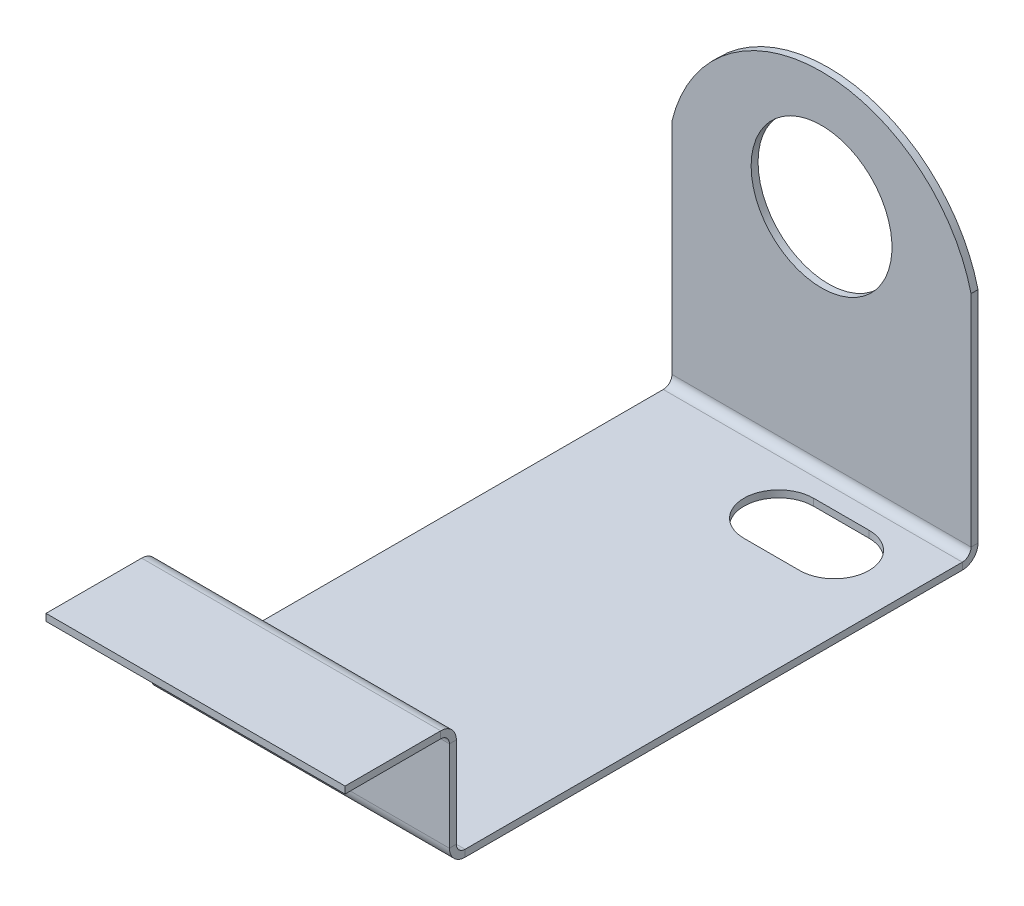
ISO-10303-21;
HEADER;
FILE_DESCRIPTION(('STEP AP214'),'2;1');
FILE_NAME('part.step','',(''),(''),'','','');
FILE_SCHEMA(('AUTOMOTIVE_DESIGN { 1 0 10303 214 1 1 1 1 }'));
ENDSEC;
DATA;
#1=APPLICATION_CONTEXT('core data for automotive mechanical design processes');
#2=APPLICATION_PROTOCOL_DEFINITION('international standard','automotive_design',2000,#1);
#3=PRODUCT_CONTEXT('',#1,'mechanical');
#4=PRODUCT('Part','Part','',(#3));
#5=PRODUCT_RELATED_PRODUCT_CATEGORY('part','',(#4));
#6=PRODUCT_DEFINITION_FORMATION('','',#4);
#7=PRODUCT_DEFINITION_CONTEXT('part definition',#1,'design');
#8=PRODUCT_DEFINITION('design','',#6,#7);
#9=PRODUCT_DEFINITION_SHAPE('','',#8);
#10=(LENGTH_UNIT() NAMED_UNIT(*) SI_UNIT(.MILLI.,.METRE.));
#11=(NAMED_UNIT(*) PLANE_ANGLE_UNIT() SI_UNIT($,.RADIAN.));
#12=(NAMED_UNIT(*) SI_UNIT($,.STERADIAN.) SOLID_ANGLE_UNIT());
#13=UNCERTAINTY_MEASURE_WITH_UNIT(LENGTH_MEASURE(1.E-05),#10,'distance_accuracy_value','');
#14=(GEOMETRIC_REPRESENTATION_CONTEXT(3) GLOBAL_UNCERTAINTY_ASSIGNED_CONTEXT((#13)) GLOBAL_UNIT_ASSIGNED_CONTEXT((#10,
#11,#12)) REPRESENTATION_CONTEXT('',''));
#15=CARTESIAN_POINT('',(0.,0.,0.));
#16=DIRECTION('',(0.,0.,1.));
#17=DIRECTION('',(1.,0.,0.));
#18=AXIS2_PLACEMENT_3D('',#15,#16,#17);
#19=CARTESIAN_POINT('',(86.,-148.497787143782,-31.9999999999995));
#20=DIRECTION('',(-1.,0.,0.));
#21=DIRECTION('',(0.,1.,0.));
#22=AXIS2_PLACEMENT_3D('',#19,#20,#21);
#23=PLANE('',#22);
#24=DIRECTION('',(0.,1.,0.));
#25=VECTOR('',#24,1.);
#26=CARTESIAN_POINT('',(86.,-148.497787143782,-31.9999999999995));
#27=LINE('',#26,#25);
#28=CARTESIAN_POINT('',(86.,2.49999999999999,-32.));
#29=VERTEX_POINT('',#28);
#30=CARTESIAN_POINT('',(86.,28.5000000000001,-32.0000000000001));
#31=VERTEX_POINT('',#30);
#32=EDGE_CURVE('E372',#29,#31,#27,.T.);
#33=ORIENTED_EDGE('',*,*,#32,.T.);
#34=DIRECTION('',(0.,0.,1.));
#35=VECTOR('',#34,1.);
#36=CARTESIAN_POINT('',(86.,28.5000000000001,-32.0000000000002));
#37=LINE('',#36,#35);
#38=CARTESIAN_POINT('',(86.,28.5,-30.0000000000001));
#39=VERTEX_POINT('',#38);
#40=EDGE_CURVE('E12',#31,#39,#37,.T.);
#41=ORIENTED_EDGE('',*,*,#40,.T.);
#42=DIRECTION('',(0.,1.,0.));
#43=VECTOR('',#42,1.);
#44=CARTESIAN_POINT('',(86.,-148.497787143782,-29.9999999999995));
#45=LINE('',#44,#43);
#46=CARTESIAN_POINT('',(86.,2.50000000000002,-30.));
#47=VERTEX_POINT('',#46);
#48=EDGE_CURVE('E271',#47,#39,#45,.T.);
#49=ORIENTED_EDGE('',*,*,#48,.F.);
#50=DIRECTION('',(0.,0.,1.));
#51=VECTOR('',#50,1.);
#52=CARTESIAN_POINT('',(86.,2.50000000000006,-32.0000000000001));
#53=LINE('',#52,#51);
#54=EDGE_CURVE('E355',#29,#47,#53,.T.);
#55=ORIENTED_EDGE('',*,*,#54,.F.);
#56=EDGE_LOOP('',(#33,#41,#49,#55));
#57=FACE_BOUND('',#56,.T.);
#58=ADVANCED_FACE('F37',(#57),#23,.F.);
#59=CARTESIAN_POINT('',(0.,-148.497787143782,-31.9999999999995));
#60=DIRECTION('',(0.,0.,1.));
#61=DIRECTION('',(0.,-1.,0.));
#62=AXIS2_PLACEMENT_3D('',#59,#60,#61);
#63=PLANE('',#62);
#64=DIRECTION('',(0.,1.,0.));
#65=VECTOR('',#64,1.);
#66=CARTESIAN_POINT('',(0.,-148.497787143782,-31.9999999999995));
#67=LINE('',#66,#65);
#68=CARTESIAN_POINT('',(0.,2.50000000000001,-32.));
#69=VERTEX_POINT('',#68);
#70=CARTESIAN_POINT('',(0.,28.5000000000001,-32.0000000000001));
#71=VERTEX_POINT('',#70);
#72=EDGE_CURVE('E40',#69,#71,#67,.T.);
#73=ORIENTED_EDGE('',*,*,#72,.T.);
#74=DIRECTION('',(1.,0.,0.));
#75=VECTOR('',#74,1.);
#76=CARTESIAN_POINT('',(0.,28.5000000000001,-32.0000000000001));
#77=LINE('',#76,#75);
#78=EDGE_CURVE('E365',#71,#31,#77,.T.);
#79=ORIENTED_EDGE('',*,*,#78,.T.);
#80=ORIENTED_EDGE('',*,*,#32,.F.);
#81=DIRECTION('',(1.,0.,0.));
#82=VECTOR('',#81,1.);
#83=CARTESIAN_POINT('',(0.,2.50000000000006,-32.));
#84=LINE('',#83,#82);
#85=EDGE_CURVE('E352',#69,#29,#84,.T.);
#86=ORIENTED_EDGE('',*,*,#85,.F.);
#87=EDGE_LOOP('',(#73,#79,#80,#86));
#88=FACE_BOUND('',#87,.T.);
#89=ADVANCED_FACE('F383',(#88),#63,.F.);
#90=CARTESIAN_POINT('',(0.,-148.497787143782,-29.9999999999995));
#91=DIRECTION('',(1.,0.,0.));
#92=DIRECTION('',(0.,-1.,0.));
#93=AXIS2_PLACEMENT_3D('',#90,#91,#92);
#94=PLANE('',#93);
#95=DIRECTION('',(0.,1.,0.));
#96=VECTOR('',#95,1.);
#97=CARTESIAN_POINT('',(0.,-148.497787143782,-29.9999999999995));
#98=LINE('',#97,#96);
#99=CARTESIAN_POINT('',(0.,2.50000000000002,-30.));
#100=VERTEX_POINT('',#99);
#101=CARTESIAN_POINT('',(0.,28.5000000000001,-30.0000000000001));
#102=VERTEX_POINT('',#101);
#103=EDGE_CURVE('E356',#100,#102,#98,.T.);
#104=ORIENTED_EDGE('',*,*,#103,.T.);
#105=DIRECTION('',(0.,0.,-1.));
#106=VECTOR('',#105,1.);
#107=CARTESIAN_POINT('',(0.,28.5000000000001,-30.0000000000002));
#108=LINE('',#107,#106);
#109=EDGE_CURVE('E368',#102,#71,#108,.T.);
#110=ORIENTED_EDGE('',*,*,#109,.T.);
#111=ORIENTED_EDGE('',*,*,#72,.F.);
#112=DIRECTION('',(0.,0.,-1.));
#113=VECTOR('',#112,1.);
#114=CARTESIAN_POINT('',(0.,2.50000000000007,-30.0000000000001));
#115=LINE('',#114,#113);
#116=EDGE_CURVE('E362',#100,#69,#115,.T.);
#117=ORIENTED_EDGE('',*,*,#116,.F.);
#118=EDGE_LOOP('',(#104,#110,#111,#117));
#119=FACE_BOUND('',#118,.T.);
#120=ADVANCED_FACE('F386',(#119),#94,.F.);
#121=CARTESIAN_POINT('',(0.,-148.497787143782,-29.9999999999995));
#122=DIRECTION('',(0.,0.,1.));
#123=DIRECTION('',(0.,-1.,0.));
#124=AXIS2_PLACEMENT_3D('',#121,#122,#123);
#125=PLANE('',#124);
#126=DIRECTION('',(1.,0.,0.));
#127=VECTOR('',#126,1.);
#128=CARTESIAN_POINT('',(0.,28.5000000000001,-30.0000000000001));
#129=LINE('',#128,#127);
#130=EDGE_CURVE('E45',#102,#39,#129,.T.);
#131=ORIENTED_EDGE('',*,*,#130,.F.);
#132=ORIENTED_EDGE('',*,*,#103,.F.);
#133=DIRECTION('',(1.,0.,0.));
#134=VECTOR('',#133,1.);
#135=CARTESIAN_POINT('',(0.,2.50000000000007,-30.));
#136=LINE('',#135,#134);
#137=EDGE_CURVE('E359',#100,#47,#136,.T.);
#138=ORIENTED_EDGE('',*,*,#137,.T.);
#139=ORIENTED_EDGE('',*,*,#48,.T.);
#140=EDGE_LOOP('',(#131,#132,#138,#139));
#141=FACE_BOUND('',#140,.T.);
#142=ADVANCED_FACE('F454',(#141),#125,.T.);
#143=CARTESIAN_POINT('',(43.,55.1788366009013,-180.));
#144=DIRECTION('',(0.,0.,-1.));
#145=DIRECTION('',(-1.,0.,0.));
#146=AXIS2_PLACEMENT_3D('',#143,#144,#145);
#147=CYLINDRICAL_SURFACE('',#146,44.2489583618449);
#148=DIRECTION('',(0.,0.,1.));
#149=VECTOR('',#148,1.);
#150=CARTESIAN_POINT('',(0.,65.6177214124262,-180.));
#151=LINE('',#150,#149);
#152=CARTESIAN_POINT('',(0.,65.6177214124262,-180.));
#153=VERTEX_POINT('',#152);
#154=CARTESIAN_POINT('',(0.,65.6177214124262,-182.));
#155=VERTEX_POINT('',#154);
#156=EDGE_CURVE('E341',#153,#155,#151,.F.);
#157=ORIENTED_EDGE('',*,*,#156,.F.);
#158=CARTESIAN_POINT('',(43.,55.1788366009013,-180.));
#159=DIRECTION('',(0.,0.,-1.));
#160=DIRECTION('',(-1.,0.,0.));
#161=AXIS2_PLACEMENT_3D('',#158,#159,#160);
#162=CIRCLE('',#161,44.2489583618449);
#163=CARTESIAN_POINT('',(86.,65.6177214124262,-180.));
#164=VERTEX_POINT('',#163);
#165=EDGE_CURVE('E324',#164,#153,#162,.F.);
#166=ORIENTED_EDGE('',*,*,#165,.F.);
#167=DIRECTION('',(0.,0.,1.));
#168=VECTOR('',#167,1.);
#169=CARTESIAN_POINT('',(86.,65.6177214124262,-180.));
#170=LINE('',#169,#168);
#171=CARTESIAN_POINT('',(86.,65.6177214124262,-182.));
#172=VERTEX_POINT('',#171);
#173=EDGE_CURVE('E349',#164,#172,#170,.F.);
#174=ORIENTED_EDGE('',*,*,#173,.T.);
#175=CARTESIAN_POINT('',(43.,55.1788366009013,-182.));
#176=DIRECTION('',(0.,0.,-1.));
#177=DIRECTION('',(-1.,0.,0.));
#178=AXIS2_PLACEMENT_3D('',#175,#176,#177);
#179=CIRCLE('',#178,44.2489583618449);
#180=EDGE_CURVE('E347',#172,#155,#179,.F.);
#181=ORIENTED_EDGE('',*,*,#180,.T.);
#182=EDGE_LOOP('',(#157,#166,#174,#181));
#183=FACE_BOUND('',#182,.T.);
#184=ADVANCED_FACE('F456',(#183),#147,.T.);
#185=CARTESIAN_POINT('',(43.0084201572259,65.7834199573394,-172.));
#186=DIRECTION('',(0.,0.,-1.));
#187=DIRECTION('',(-1.,0.,0.));
#188=AXIS2_PLACEMENT_3D('',#185,#186,#187);
#189=CYLINDRICAL_SURFACE('',#188,20.25);
#190=CARTESIAN_POINT('',(43.0084201572259,65.7834199573394,-182.));
#191=DIRECTION('',(0.,0.,-1.));
#192=DIRECTION('',(-1.,0.,0.));
#193=AXIS2_PLACEMENT_3D('',#190,#191,#192);
#194=CIRCLE('',#193,20.25);
#195=CARTESIAN_POINT('',(22.7584201572259,65.7834199573394,-182.));
#196=VERTEX_POINT('',#195);
#197=EDGE_CURVE('E344',#196,#196,#194,.T.);
#198=ORIENTED_EDGE('',*,*,#197,.T.);
#199=EDGE_LOOP('',(#198));
#200=FACE_BOUND('',#199,.T.);
#201=CARTESIAN_POINT('',(43.0084201572259,65.7834199573394,-180.));
#202=DIRECTION('',(0.,0.,-1.));
#203=DIRECTION('',(-1.,0.,0.));
#204=AXIS2_PLACEMENT_3D('',#201,#202,#203);
#205=CIRCLE('',#204,20.25);
#206=CARTESIAN_POINT('',(22.7584201572259,65.7834199573394,-180.));
#207=VERTEX_POINT('',#206);
#208=EDGE_CURVE('E327',#207,#207,#205,.T.);
#209=ORIENTED_EDGE('',*,*,#208,.F.);
#210=EDGE_LOOP('',(#209));
#211=FACE_BOUND('',#210,.T.);
#212=ADVANCED_FACE('F461',(#200,#211),#189,.F.);
#213=CARTESIAN_POINT('',(0.,0.,-182.));
#214=DIRECTION('',(-1.,0.,0.));
#215=DIRECTION('',(0.,0.,1.));
#216=AXIS2_PLACEMENT_3D('',#213,#214,#215);
#217=PLANE('',#216);
#218=DIRECTION('',(0.,-1.,0.));
#219=VECTOR('',#218,1.);
#220=CARTESIAN_POINT('',(0.,0.,-180.));
#221=LINE('',#220,#219);
#222=CARTESIAN_POINT('',(0.,2.49999999999998,-180.));
#223=VERTEX_POINT('',#222);
#224=EDGE_CURVE('E322',#153,#223,#221,.T.);
#225=ORIENTED_EDGE('',*,*,#224,.F.);
#226=ORIENTED_EDGE('',*,*,#156,.T.);
#227=DIRECTION('',(0.,-1.,0.));
#228=VECTOR('',#227,1.);
#229=CARTESIAN_POINT('',(0.,0.,-182.));
#230=LINE('',#229,#228);
#231=CARTESIAN_POINT('',(0.,2.50000000000002,-182.));
#232=VERTEX_POINT('',#231);
#233=EDGE_CURVE('E339',#155,#232,#230,.T.);
#234=ORIENTED_EDGE('',*,*,#233,.T.);
#235=DIRECTION('',(0.,0.,-1.));
#236=VECTOR('',#235,1.);
#237=CARTESIAN_POINT('',(0.,2.5,-180.));
#238=LINE('',#237,#236);
#239=EDGE_CURVE('E316',#223,#232,#238,.T.);
#240=ORIENTED_EDGE('',*,*,#239,.F.);
#241=EDGE_LOOP('',(#225,#226,#234,#240));
#242=FACE_BOUND('',#241,.T.);
#243=ADVANCED_FACE('F502',(#242),#217,.T.);
#244=CARTESIAN_POINT('',(0.,0.,-182.));
#245=DIRECTION('',(0.,0.,-1.));
#246=DIRECTION('',(-1.,0.,0.));
#247=AXIS2_PLACEMENT_3D('',#244,#245,#246);
#248=PLANE('',#247);
#249=ORIENTED_EDGE('',*,*,#197,.F.);
#250=EDGE_LOOP('',(#249));
#251=FACE_BOUND('',#250,.T.);
#252=ORIENTED_EDGE('',*,*,#233,.F.);
#253=ORIENTED_EDGE('',*,*,#180,.F.);
#254=DIRECTION('',(0.,1.,0.));
#255=VECTOR('',#254,1.);
#256=CARTESIAN_POINT('',(86.,100.,-182.));
#257=LINE('',#256,#255);
#258=CARTESIAN_POINT('',(86.,2.49999999999998,-182.));
#259=VERTEX_POINT('',#258);
#260=EDGE_CURVE('E333',#259,#172,#257,.T.);
#261=ORIENTED_EDGE('',*,*,#260,.F.);
#262=DIRECTION('',(-1.,0.,0.));
#263=VECTOR('',#262,1.);
#264=CARTESIAN_POINT('',(0.,2.50000000000002,-182.));
#265=LINE('',#264,#263);
#266=EDGE_CURVE('E336',#259,#232,#265,.T.);
#267=ORIENTED_EDGE('',*,*,#266,.T.);
#268=EDGE_LOOP('',(#252,#253,#261,#267));
#269=FACE_BOUND('',#268,.T.);
#270=ADVANCED_FACE('F498',(#251,#269),#248,.T.);
#271=CARTESIAN_POINT('',(86.,100.,-182.));
#272=DIRECTION('',(1.,0.,0.));
#273=DIRECTION('',(0.,0.,-1.));
#274=AXIS2_PLACEMENT_3D('',#271,#272,#273);
#275=PLANE('',#274);
#276=ORIENTED_EDGE('',*,*,#260,.T.);
#277=ORIENTED_EDGE('',*,*,#173,.F.);
#278=DIRECTION('',(0.,1.,0.));
#279=VECTOR('',#278,1.);
#280=CARTESIAN_POINT('',(86.,100.,-180.));
#281=LINE('',#280,#279);
#282=CARTESIAN_POINT('',(86.,2.49999999999998,-180.));
#283=VERTEX_POINT('',#282);
#284=EDGE_CURVE('E319',#283,#164,#281,.T.);
#285=ORIENTED_EDGE('',*,*,#284,.F.);
#286=DIRECTION('',(0.,0.,-1.));
#287=VECTOR('',#286,1.);
#288=CARTESIAN_POINT('',(86.,2.5,-180.));
#289=LINE('',#288,#287);
#290=EDGE_CURVE('E330',#283,#259,#289,.T.);
#291=ORIENTED_EDGE('',*,*,#290,.T.);
#292=EDGE_LOOP('',(#276,#277,#285,#291));
#293=FACE_BOUND('',#292,.T.);
#294=ADVANCED_FACE('F494',(#293),#275,.T.);
#295=CARTESIAN_POINT('',(0.,0.,-180.));
#296=DIRECTION('',(0.,0.,-1.));
#297=DIRECTION('',(-1.,0.,0.));
#298=AXIS2_PLACEMENT_3D('',#295,#296,#297);
#299=PLANE('',#298);
#300=ORIENTED_EDGE('',*,*,#208,.T.);
#301=EDGE_LOOP('',(#300));
#302=FACE_BOUND('',#301,.T.);
#303=ORIENTED_EDGE('',*,*,#165,.T.);
#304=ORIENTED_EDGE('',*,*,#224,.T.);
#305=DIRECTION('',(-1.,0.,0.));
#306=VECTOR('',#305,1.);
#307=CARTESIAN_POINT('',(86.,2.5,-180.));
#308=LINE('',#307,#306);
#309=EDGE_CURVE('E299',#283,#223,#308,.T.);
#310=ORIENTED_EDGE('',*,*,#309,.F.);
#311=ORIENTED_EDGE('',*,*,#284,.T.);
#312=EDGE_LOOP('',(#303,#304,#310,#311));
#313=FACE_BOUND('',#312,.T.);
#314=ADVANCED_FACE('F490',(#302,#313),#299,.F.);
#315=CARTESIAN_POINT('',(0.,2.49999999999998,-177.5));
#316=DIRECTION('',(1.,0.,0.));
#317=DIRECTION('',(0.,0.,-1.));
#318=AXIS2_PLACEMENT_3D('',#315,#316,#317);
#319=PLANE('',#318);
#320=CARTESIAN_POINT('',(0.,2.49999999999998,-177.5));
#321=DIRECTION('',(-1.,0.,0.));
#322=DIRECTION('',(0.,0.,1.));
#323=AXIS2_PLACEMENT_3D('',#320,#321,#322);
#324=CIRCLE('',#323,2.5);
#325=CARTESIAN_POINT('',(0.,0.,-177.5));
#326=VERTEX_POINT('',#325);
#327=EDGE_CURVE('E296',#223,#326,#324,.T.);
#328=ORIENTED_EDGE('',*,*,#327,.F.);
#329=ORIENTED_EDGE('',*,*,#239,.T.);
#330=CARTESIAN_POINT('',(0.,2.49999999999998,-177.5));
#331=DIRECTION('',(-1.,0.,0.));
#332=DIRECTION('',(0.,0.,1.));
#333=AXIS2_PLACEMENT_3D('',#330,#331,#332);
#334=CIRCLE('',#333,4.5);
#335=CARTESIAN_POINT('',(0.,-2.00000000000002,-177.5));
#336=VERTEX_POINT('',#335);
#337=EDGE_CURVE('E313',#232,#336,#334,.T.);
#338=ORIENTED_EDGE('',*,*,#337,.T.);
#339=DIRECTION('',(0.,-1.,0.));
#340=VECTOR('',#339,1.);
#341=CARTESIAN_POINT('',(0.,0.,-177.5));
#342=LINE('',#341,#340);
#343=EDGE_CURVE('E268',#326,#336,#342,.T.);
#344=ORIENTED_EDGE('',*,*,#343,.F.);
#345=EDGE_LOOP('',(#328,#329,#338,#344));
#346=FACE_BOUND('',#345,.T.);
#347=ADVANCED_FACE('F486',(#346),#319,.F.);
#348=CARTESIAN_POINT('',(0.,2.49999999999998,-177.5));
#349=DIRECTION('',(-1.,0.,0.));
#350=DIRECTION('',(0.,0.,-1.));
#351=AXIS2_PLACEMENT_3D('',#348,#349,#350);
#352=CYLINDRICAL_SURFACE('',#351,4.5);
#353=DIRECTION('',(-1.,0.,0.));
#354=VECTOR('',#353,1.);
#355=CARTESIAN_POINT('',(0.,-2.00000000000002,-177.5));
#356=LINE('',#355,#354);
#357=CARTESIAN_POINT('',(86.,-2.,-177.5));
#358=VERTEX_POINT('',#357);
#359=EDGE_CURVE('E281',#336,#358,#356,.F.);
#360=ORIENTED_EDGE('',*,*,#359,.F.);
#361=ORIENTED_EDGE('',*,*,#337,.F.);
#362=ORIENTED_EDGE('',*,*,#266,.F.);
#363=CARTESIAN_POINT('',(86.,2.49999999999998,-177.5));
#364=DIRECTION('',(-1.,0.,0.));
#365=DIRECTION('',(0.,0.,1.));
#366=AXIS2_PLACEMENT_3D('',#363,#364,#365);
#367=CIRCLE('',#366,4.5);
#368=EDGE_CURVE('E307',#358,#259,#367,.F.);
#369=ORIENTED_EDGE('',*,*,#368,.F.);
#370=EDGE_LOOP('',(#360,#361,#362,#369));
#371=FACE_BOUND('',#370,.T.);
#372=ADVANCED_FACE('F482',(#371),#352,.T.);
#373=CARTESIAN_POINT('',(86.,2.49999999999998,-177.5));
#374=DIRECTION('',(1.,0.,0.));
#375=DIRECTION('',(0.,0.,-1.));
#376=AXIS2_PLACEMENT_3D('',#373,#374,#375);
#377=PLANE('',#376);
#378=ORIENTED_EDGE('',*,*,#290,.F.);
#379=CARTESIAN_POINT('',(86.,2.49999999999998,-177.5));
#380=DIRECTION('',(-1.,0.,0.));
#381=DIRECTION('',(0.,0.,1.));
#382=AXIS2_PLACEMENT_3D('',#379,#380,#381);
#383=CIRCLE('',#382,2.5);
#384=CARTESIAN_POINT('',(86.,0.,-177.5));
#385=VERTEX_POINT('',#384);
#386=EDGE_CURVE('E302',#385,#283,#383,.F.);
#387=ORIENTED_EDGE('',*,*,#386,.F.);
#388=DIRECTION('',(0.,-1.,0.));
#389=VECTOR('',#388,1.);
#390=CARTESIAN_POINT('',(86.,0.,-177.5));
#391=LINE('',#390,#389);
#392=EDGE_CURVE('E310',#385,#358,#391,.T.);
#393=ORIENTED_EDGE('',*,*,#392,.T.);
#394=ORIENTED_EDGE('',*,*,#368,.T.);
#395=EDGE_LOOP('',(#378,#387,#393,#394));
#396=FACE_BOUND('',#395,.T.);
#397=ADVANCED_FACE('F478',(#396),#377,.T.);
#398=CARTESIAN_POINT('',(0.,2.49999999999998,-177.5));
#399=DIRECTION('',(-1.,0.,0.));
#400=DIRECTION('',(0.,0.,-1.));
#401=AXIS2_PLACEMENT_3D('',#398,#399,#400);
#402=CYLINDRICAL_SURFACE('',#401,2.5);
#403=DIRECTION('',(-1.,0.,0.));
#404=VECTOR('',#403,1.);
#405=CARTESIAN_POINT('',(0.,0.,-177.5));
#406=LINE('',#405,#404);
#407=EDGE_CURVE('E305',#326,#385,#406,.F.);
#408=ORIENTED_EDGE('',*,*,#407,.T.);
#409=ORIENTED_EDGE('',*,*,#386,.T.);
#410=ORIENTED_EDGE('',*,*,#309,.T.);
#411=ORIENTED_EDGE('',*,*,#327,.T.);
#412=EDGE_LOOP('',(#408,#409,#410,#411));
#413=FACE_BOUND('',#412,.T.);
#414=ADVANCED_FACE('F474',(#413),#402,.F.);
#415=CARTESIAN_POINT('',(0.,0.,-180.));
#416=DIRECTION('',(0.,-1.,0.));
#417=DIRECTION('',(0.,0.,-1.));
#418=AXIS2_PLACEMENT_3D('',#415,#416,#417);
#419=PLANE('',#418);
#420=DIRECTION('',(-1.,0.,0.));
#421=VECTOR('',#420,1.);
#422=CARTESIAN_POINT('',(64.665337354633,0.,-172.034002172437));
#423=LINE('',#422,#421);
#424=CARTESIAN_POINT('',(64.665337354633,0.,-172.034002172437));
#425=VERTEX_POINT('',#424);
#426=CARTESIAN_POINT('',(48.665337354633,0.,-172.034002172437));
#427=VERTEX_POINT('',#426);
#428=EDGE_CURVE('E202',#425,#427,#423,.T.);
#429=ORIENTED_EDGE('',*,*,#428,.F.);
#430=CARTESIAN_POINT('',(64.665337354633,0.,-162.034002172437));
#431=DIRECTION('',(0.,1.,0.));
#432=DIRECTION('',(0.,0.,1.));
#433=AXIS2_PLACEMENT_3D('',#430,#431,#432);
#434=CIRCLE('',#433,9.99999999999998);
#435=CARTESIAN_POINT('',(64.665337354633,0.,-152.034002172437));
#436=VERTEX_POINT('',#435);
#437=EDGE_CURVE('E53',#436,#425,#434,.T.);
#438=ORIENTED_EDGE('',*,*,#437,.F.);
#439=DIRECTION('',(1.,0.,0.));
#440=VECTOR('',#439,1.);
#441=CARTESIAN_POINT('',(64.665337354633,0.,-152.034002172437));
#442=LINE('',#441,#440);
#443=CARTESIAN_POINT('',(48.665337354633,0.,-152.034002172437));
#444=VERTEX_POINT('',#443);
#445=EDGE_CURVE('E193',#444,#436,#442,.T.);
#446=ORIENTED_EDGE('',*,*,#445,.F.);
#447=CARTESIAN_POINT('',(48.665337354633,0.,-162.034002172437));
#448=DIRECTION('',(0.,1.,0.));
#449=DIRECTION('',(0.,0.,-1.));
#450=AXIS2_PLACEMENT_3D('',#447,#448,#449);
#451=CIRCLE('',#450,9.99999999999998);
#452=EDGE_CURVE('E196',#427,#444,#451,.T.);
#453=ORIENTED_EDGE('',*,*,#452,.F.);
#454=EDGE_LOOP('',(#429,#438,#446,#453));
#455=FACE_BOUND('',#454,.T.);
#456=DIRECTION('',(0.,0.,1.));
#457=VECTOR('',#456,1.);
#458=CARTESIAN_POINT('',(0.,0.,-180.));
#459=LINE('',#458,#457);
#460=CARTESIAN_POINT('',(0.,0.,-34.5));
#461=VERTEX_POINT('',#460);
#462=EDGE_CURVE('E293',#326,#461,#459,.T.);
#463=ORIENTED_EDGE('',*,*,#462,.T.);
#464=DIRECTION('',(1.,0.,0.));
#465=VECTOR('',#464,1.);
#466=CARTESIAN_POINT('',(0.,0.,-34.5));
#467=LINE('',#466,#465);
#468=CARTESIAN_POINT('',(86.,0.,-34.5));
#469=VERTEX_POINT('',#468);
#470=EDGE_CURVE('E290',#461,#469,#467,.T.);
#471=ORIENTED_EDGE('',*,*,#470,.T.);
#472=DIRECTION('',(0.,0.,1.));
#473=VECTOR('',#472,1.);
#474=CARTESIAN_POINT('',(86.,0.,-180.));
#475=LINE('',#474,#473);
#476=EDGE_CURVE('E287',#385,#469,#475,.T.);
#477=ORIENTED_EDGE('',*,*,#476,.F.);
#478=ORIENTED_EDGE('',*,*,#407,.F.);
#479=EDGE_LOOP('',(#463,#471,#477,#478));
#480=FACE_BOUND('',#479,.T.);
#481=ADVANCED_FACE('F441',(#455,#480),#419,.F.);
#482=CARTESIAN_POINT('',(86.,0.,-180.));
#483=DIRECTION('',(-1.,0.,0.));
#484=DIRECTION('',(0.,0.,1.));
#485=AXIS2_PLACEMENT_3D('',#482,#483,#484);
#486=PLANE('',#485);
#487=ORIENTED_EDGE('',*,*,#476,.T.);
#488=DIRECTION('',(0.,-1.,0.));
#489=VECTOR('',#488,1.);
#490=CARTESIAN_POINT('',(86.,0.,-34.5));
#491=LINE('',#490,#489);
#492=CARTESIAN_POINT('',(86.,-2.,-34.5));
#493=VERTEX_POINT('',#492);
#494=EDGE_CURVE('E284',#469,#493,#491,.T.);
#495=ORIENTED_EDGE('',*,*,#494,.T.);
#496=DIRECTION('',(0.,0.,1.));
#497=VECTOR('',#496,1.);
#498=CARTESIAN_POINT('',(86.,-2.,-180.));
#499=LINE('',#498,#497);
#500=EDGE_CURVE('E278',#358,#493,#499,.T.);
#501=ORIENTED_EDGE('',*,*,#500,.F.);
#502=ORIENTED_EDGE('',*,*,#392,.F.);
#503=EDGE_LOOP('',(#487,#495,#501,#502));
#504=FACE_BOUND('',#503,.T.);
#505=ADVANCED_FACE('F436',(#504),#486,.F.);
#506=CARTESIAN_POINT('',(0.,-2.,-180.));
#507=DIRECTION('',(0.,-1.,0.));
#508=DIRECTION('',(0.,0.,-1.));
#509=AXIS2_PLACEMENT_3D('',#506,#507,#508);
#510=PLANE('',#509);
#511=CARTESIAN_POINT('',(64.665337354633,-2.00000000000002,-162.034002172437));
#512=DIRECTION('',(0.,1.,0.));
#513=DIRECTION('',(0.,0.,1.));
#514=AXIS2_PLACEMENT_3D('',#511,#512,#513);
#515=CIRCLE('',#514,9.99999999999998);
#516=CARTESIAN_POINT('',(64.665337354633,-2.00000000000002,-152.034002172437));
#517=VERTEX_POINT('',#516);
#518=CARTESIAN_POINT('',(64.665337354633,-2.00000000000002,-172.034002172437));
#519=VERTEX_POINT('',#518);
#520=EDGE_CURVE('E177',#517,#519,#515,.T.);
#521=ORIENTED_EDGE('',*,*,#520,.T.);
#522=DIRECTION('',(-1.,0.,0.));
#523=VECTOR('',#522,1.);
#524=CARTESIAN_POINT('',(64.665337354633,-2.00000000000002,-172.034002172437));
#525=LINE('',#524,#523);
#526=CARTESIAN_POINT('',(48.665337354633,-2.,-172.034002172437));
#527=VERTEX_POINT('',#526);
#528=EDGE_CURVE('E186',#519,#527,#525,.T.);
#529=ORIENTED_EDGE('',*,*,#528,.T.);
#530=CARTESIAN_POINT('',(48.665337354633,-2.00000000000002,-162.034002172437));
#531=DIRECTION('',(0.,1.,0.));
#532=DIRECTION('',(0.,0.,-1.));
#533=AXIS2_PLACEMENT_3D('',#530,#531,#532);
#534=CIRCLE('',#533,9.99999999999998);
#535=CARTESIAN_POINT('',(48.665337354633,-2.00000000000002,-152.034002172437));
#536=VERTEX_POINT('',#535);
#537=EDGE_CURVE('E61',#527,#536,#534,.T.);
#538=ORIENTED_EDGE('',*,*,#537,.T.);
#539=DIRECTION('',(1.,0.,0.));
#540=VECTOR('',#539,1.);
#541=CARTESIAN_POINT('',(64.665337354633,-2.00000000000002,-152.034002172437));
#542=LINE('',#541,#540);
#543=EDGE_CURVE('E183',#536,#517,#542,.T.);
#544=ORIENTED_EDGE('',*,*,#543,.T.);
#545=EDGE_LOOP('',(#521,#529,#538,#544));
#546=FACE_BOUND('',#545,.T.);
#547=DIRECTION('',(1.,0.,0.));
#548=VECTOR('',#547,1.);
#549=CARTESIAN_POINT('',(0.,-2.,-34.5));
#550=LINE('',#549,#548);
#551=CARTESIAN_POINT('',(0.,-2.,-34.5000000000001));
#552=VERTEX_POINT('',#551);
#553=EDGE_CURVE('E263',#552,#493,#550,.T.);
#554=ORIENTED_EDGE('',*,*,#553,.F.);
#555=DIRECTION('',(0.,0.,1.));
#556=VECTOR('',#555,1.);
#557=CARTESIAN_POINT('',(0.,-2.,-180.));
#558=LINE('',#557,#556);
#559=EDGE_CURVE('E275',#336,#552,#558,.T.);
#560=ORIENTED_EDGE('',*,*,#559,.F.);
#561=ORIENTED_EDGE('',*,*,#359,.T.);
#562=ORIENTED_EDGE('',*,*,#500,.T.);
#563=EDGE_LOOP('',(#554,#560,#561,#562));
#564=FACE_BOUND('',#563,.T.);
#565=ADVANCED_FACE('F190',(#546,#564),#510,.T.);
#566=CARTESIAN_POINT('',(0.,-2.,-180.));
#567=DIRECTION('',(1.,0.,0.));
#568=DIRECTION('',(0.,0.,-1.));
#569=AXIS2_PLACEMENT_3D('',#566,#567,#568);
#570=PLANE('',#569);
#571=ORIENTED_EDGE('',*,*,#559,.T.);
#572=DIRECTION('',(0.,1.,0.));
#573=VECTOR('',#572,1.);
#574=CARTESIAN_POINT('',(0.,-1.99999999999999,-34.5));
#575=LINE('',#574,#573);
#576=EDGE_CURVE('E272',#552,#461,#575,.T.);
#577=ORIENTED_EDGE('',*,*,#576,.T.);
#578=ORIENTED_EDGE('',*,*,#462,.F.);
#579=ORIENTED_EDGE('',*,*,#343,.T.);
#580=EDGE_LOOP('',(#571,#577,#578,#579));
#581=FACE_BOUND('',#580,.T.);
#582=ADVANCED_FACE('F444',(#581),#570,.F.);
#583=CARTESIAN_POINT('',(0.,2.5,-34.5));
#584=DIRECTION('',(1.,0.,0.));
#585=DIRECTION('',(0.,0.,-1.));
#586=AXIS2_PLACEMENT_3D('',#583,#584,#585);
#587=PLANE('',#586);
#588=ORIENTED_EDGE('',*,*,#576,.F.);
#589=CARTESIAN_POINT('',(0.,2.5,-34.5));
#590=DIRECTION('',(1.,0.,0.));
#591=DIRECTION('',(0.,0.,-1.));
#592=AXIS2_PLACEMENT_3D('',#589,#590,#591);
#593=CIRCLE('',#592,4.5);
#594=EDGE_CURVE('E251',#552,#100,#593,.F.);
#595=ORIENTED_EDGE('',*,*,#594,.T.);
#596=ORIENTED_EDGE('',*,*,#116,.T.);
#597=CARTESIAN_POINT('',(0.,2.5,-34.5));
#598=DIRECTION('',(-1.,0.,0.));
#599=DIRECTION('',(0.,0.,1.));
#600=AXIS2_PLACEMENT_3D('',#597,#598,#599);
#601=CIRCLE('',#600,2.5);
#602=EDGE_CURVE('E256',#461,#69,#601,.T.);
#603=ORIENTED_EDGE('',*,*,#602,.F.);
#604=EDGE_LOOP('',(#588,#595,#596,#603));
#605=FACE_BOUND('',#604,.T.);
#606=ADVANCED_FACE('F449',(#605),#587,.F.);
#607=CARTESIAN_POINT('',(86.,2.5,-34.5));
#608=DIRECTION('',(-1.,0.,0.));
#609=DIRECTION('',(0.,0.,1.));
#610=AXIS2_PLACEMENT_3D('',#607,#608,#609);
#611=PLANE('',#610);
#612=ORIENTED_EDGE('',*,*,#54,.T.);
#613=CARTESIAN_POINT('',(86.,2.5,-34.5));
#614=DIRECTION('',(1.,0.,0.));
#615=DIRECTION('',(0.,0.,-1.));
#616=AXIS2_PLACEMENT_3D('',#613,#614,#615);
#617=CIRCLE('',#616,4.5);
#618=EDGE_CURVE('E260',#47,#493,#617,.T.);
#619=ORIENTED_EDGE('',*,*,#618,.T.);
#620=ORIENTED_EDGE('',*,*,#494,.F.);
#621=CARTESIAN_POINT('',(86.,2.5,-34.5));
#622=DIRECTION('',(1.,0.,0.));
#623=DIRECTION('',(0.,0.,1.));
#624=AXIS2_PLACEMENT_3D('',#621,#622,#623);
#625=CIRCLE('',#624,2.5);
#626=EDGE_CURVE('E259',#29,#469,#625,.T.);
#627=ORIENTED_EDGE('',*,*,#626,.F.);
#628=EDGE_LOOP('',(#612,#619,#620,#627));
#629=FACE_BOUND('',#628,.T.);
#630=ADVANCED_FACE('F432',(#629),#611,.F.);
#631=CARTESIAN_POINT('',(-43.1987567397485,2.5,-34.5));
#632=DIRECTION('',(1.,0.,0.));
#633=DIRECTION('',(0.,0.,-1.));
#634=AXIS2_PLACEMENT_3D('',#631,#632,#633);
#635=CYLINDRICAL_SURFACE('',#634,2.5);
#636=ORIENTED_EDGE('',*,*,#626,.T.);
#637=ORIENTED_EDGE('',*,*,#470,.F.);
#638=ORIENTED_EDGE('',*,*,#602,.T.);
#639=ORIENTED_EDGE('',*,*,#85,.T.);
#640=EDGE_LOOP('',(#636,#637,#638,#639));
#641=FACE_BOUND('',#640,.T.);
#642=ADVANCED_FACE('F429',(#641),#635,.F.);
#643=CARTESIAN_POINT('',(-43.1987567397485,2.5,-34.5));
#644=DIRECTION('',(1.,0.,0.));
#645=DIRECTION('',(0.,0.,-1.));
#646=AXIS2_PLACEMENT_3D('',#643,#644,#645);
#647=CYLINDRICAL_SURFACE('',#646,4.5);
#648=ORIENTED_EDGE('',*,*,#618,.F.);
#649=ORIENTED_EDGE('',*,*,#137,.F.);
#650=ORIENTED_EDGE('',*,*,#594,.F.);
#651=ORIENTED_EDGE('',*,*,#553,.T.);
#652=EDGE_LOOP('',(#648,#649,#650,#651));
#653=FACE_BOUND('',#652,.T.);
#654=ADVANCED_FACE('F452',(#653),#647,.T.);
#655=CARTESIAN_POINT('',(0.,28.5000000000001,-27.5000000000001));
#656=DIRECTION('',(-1.,0.,0.));
#657=DIRECTION('',(0.,0.,1.));
#658=AXIS2_PLACEMENT_3D('',#655,#656,#657);
#659=PLANE('',#658);
#660=ORIENTED_EDGE('',*,*,#109,.F.);
#661=CARTESIAN_POINT('',(0.,28.5000000000001,-27.5000000000001));
#662=DIRECTION('',(1.,0.,0.));
#663=DIRECTION('',(0.,0.,-1.));
#664=AXIS2_PLACEMENT_3D('',#661,#662,#663);
#665=CIRCLE('',#664,2.5);
#666=CARTESIAN_POINT('',(0.,31.,-27.5000000000001));
#667=VERTEX_POINT('',#666);
#668=EDGE_CURVE('E215',#102,#667,#665,.T.);
#669=ORIENTED_EDGE('',*,*,#668,.T.);
#670=DIRECTION('',(0.,1.,0.));
#671=VECTOR('',#670,1.);
#672=CARTESIAN_POINT('',(0.,31.,-27.5000000000001));
#673=LINE('',#672,#671);
#674=CARTESIAN_POINT('',(0.,33.,-27.5000000000001));
#675=VERTEX_POINT('',#674);
#676=EDGE_CURVE('E236',#667,#675,#673,.T.);
#677=ORIENTED_EDGE('',*,*,#676,.T.);
#678=CARTESIAN_POINT('',(0.,28.5000000000001,-27.5000000000001));
#679=DIRECTION('',(1.,0.,0.));
#680=DIRECTION('',(0.,0.,-1.));
#681=AXIS2_PLACEMENT_3D('',#678,#679,#680);
#682=CIRCLE('',#681,4.5);
#683=EDGE_CURVE('E244',#71,#675,#682,.T.);
#684=ORIENTED_EDGE('',*,*,#683,.F.);
#685=EDGE_LOOP('',(#660,#669,#677,#684));
#686=FACE_BOUND('',#685,.T.);
#687=ADVANCED_FACE('F389',(#686),#659,.T.);
#688=CARTESIAN_POINT('',(86.,28.5000000000001,-27.5000000000001));
#689=DIRECTION('',(1.,0.,0.));
#690=DIRECTION('',(0.,0.,-1.));
#691=AXIS2_PLACEMENT_3D('',#688,#689,#690);
#692=PLANE('',#691);
#693=DIRECTION('',(0.,-1.,0.));
#694=VECTOR('',#693,1.);
#695=CARTESIAN_POINT('',(86.,33.,-27.5000000000001));
#696=LINE('',#695,#694);
#697=CARTESIAN_POINT('',(86.,33.0000000000001,-27.5000000000002));
#698=VERTEX_POINT('',#697);
#699=CARTESIAN_POINT('',(86.,31.,-27.5000000000001));
#700=VERTEX_POINT('',#699);
#701=EDGE_CURVE('E239',#698,#700,#696,.T.);
#702=ORIENTED_EDGE('',*,*,#701,.T.);
#703=CARTESIAN_POINT('',(86.,28.5000000000001,-27.5000000000001));
#704=DIRECTION('',(1.,0.,0.));
#705=DIRECTION('',(0.,0.,-1.));
#706=AXIS2_PLACEMENT_3D('',#703,#704,#705);
#707=CIRCLE('',#706,2.5);
#708=EDGE_CURVE('E248',#700,#39,#707,.F.);
#709=ORIENTED_EDGE('',*,*,#708,.T.);
#710=ORIENTED_EDGE('',*,*,#40,.F.);
#711=CARTESIAN_POINT('',(86.,28.5000000000001,-27.5000000000001));
#712=DIRECTION('',(-1.,0.,0.));
#713=DIRECTION('',(0.,0.,-1.));
#714=AXIS2_PLACEMENT_3D('',#711,#712,#713);
#715=CIRCLE('',#714,4.5);
#716=EDGE_CURVE('E247',#698,#31,#715,.T.);
#717=ORIENTED_EDGE('',*,*,#716,.F.);
#718=EDGE_LOOP('',(#702,#709,#710,#717));
#719=FACE_BOUND('',#718,.T.);
#720=ADVANCED_FACE('F400',(#719),#692,.T.);
#721=CARTESIAN_POINT('',(-43.1987567397485,28.5000000000001,-27.5000000000001));
#722=DIRECTION('',(1.,0.,0.));
#723=DIRECTION('',(0.,0.,-1.));
#724=AXIS2_PLACEMENT_3D('',#721,#722,#723);
#725=CYLINDRICAL_SURFACE('',#724,4.5);
#726=ORIENTED_EDGE('',*,*,#716,.T.);
#727=ORIENTED_EDGE('',*,*,#78,.F.);
#728=ORIENTED_EDGE('',*,*,#683,.T.);
#729=DIRECTION('',(1.,0.,0.));
#730=VECTOR('',#729,1.);
#731=CARTESIAN_POINT('',(0.,33.,-27.5000000000001));
#732=LINE('',#731,#730);
#733=EDGE_CURVE('E208',#675,#698,#732,.T.);
#734=ORIENTED_EDGE('',*,*,#733,.T.);
#735=EDGE_LOOP('',(#726,#727,#728,#734));
#736=FACE_BOUND('',#735,.T.);
#737=ADVANCED_FACE('F410',(#736),#725,.T.);
#738=CARTESIAN_POINT('',(-43.1987567397485,28.5000000000001,-27.5000000000001));
#739=DIRECTION('',(1.,0.,0.));
#740=DIRECTION('',(0.,0.,-1.));
#741=AXIS2_PLACEMENT_3D('',#738,#739,#740);
#742=CYLINDRICAL_SURFACE('',#741,2.5);
#743=ORIENTED_EDGE('',*,*,#708,.F.);
#744=DIRECTION('',(1.,0.,0.));
#745=VECTOR('',#744,1.);
#746=CARTESIAN_POINT('',(0.,31.,-27.5000000000001));
#747=LINE('',#746,#745);
#748=EDGE_CURVE('E220',#667,#700,#747,.T.);
#749=ORIENTED_EDGE('',*,*,#748,.F.);
#750=ORIENTED_EDGE('',*,*,#668,.F.);
#751=ORIENTED_EDGE('',*,*,#130,.T.);
#752=EDGE_LOOP('',(#743,#749,#750,#751));
#753=FACE_BOUND('',#752,.T.);
#754=ADVANCED_FACE('F393',(#753),#742,.F.);
#755=CARTESIAN_POINT('',(86.,31.,0.));
#756=DIRECTION('',(0.,0.,-1.));
#757=DIRECTION('',(-1.,0.,0.));
#758=AXIS2_PLACEMENT_3D('',#755,#756,#757);
#759=PLANE('',#758);
#760=DIRECTION('',(1.,0.,0.));
#761=VECTOR('',#760,1.);
#762=CARTESIAN_POINT('',(0.,31.,0.));
#763=LINE('',#762,#761);
#764=CARTESIAN_POINT('',(0.,31.,0.));
#765=VERTEX_POINT('',#764);
#766=CARTESIAN_POINT('',(86.,31.,0.));
#767=VERTEX_POINT('',#766);
#768=EDGE_CURVE('E233',#765,#767,#763,.T.);
#769=ORIENTED_EDGE('',*,*,#768,.T.);
#770=DIRECTION('',(0.,-1.,0.));
#771=VECTOR('',#770,1.);
#772=CARTESIAN_POINT('',(86.,33.,0.));
#773=LINE('',#772,#771);
#774=CARTESIAN_POINT('',(86.,33.,0.));
#775=VERTEX_POINT('',#774);
#776=EDGE_CURVE('E212',#775,#767,#773,.T.);
#777=ORIENTED_EDGE('',*,*,#776,.F.);
#778=DIRECTION('',(1.,0.,0.));
#779=VECTOR('',#778,1.);
#780=CARTESIAN_POINT('',(0.,33.,0.));
#781=LINE('',#780,#779);
#782=CARTESIAN_POINT('',(0.,33.,0.));
#783=VERTEX_POINT('',#782);
#784=EDGE_CURVE('E228',#783,#775,#781,.T.);
#785=ORIENTED_EDGE('',*,*,#784,.F.);
#786=DIRECTION('',(0.,1.,0.));
#787=VECTOR('',#786,1.);
#788=CARTESIAN_POINT('',(0.,31.,0.));
#789=LINE('',#788,#787);
#790=EDGE_CURVE('E223',#765,#783,#789,.T.);
#791=ORIENTED_EDGE('',*,*,#790,.F.);
#792=EDGE_LOOP('',(#769,#777,#785,#791));
#793=FACE_BOUND('',#792,.T.);
#794=ADVANCED_FACE('F417',(#793),#759,.F.);
#795=CARTESIAN_POINT('',(0.,33.,-209.995574287564));
#796=DIRECTION('',(0.,-1.,0.));
#797=DIRECTION('',(0.,0.,-1.));
#798=AXIS2_PLACEMENT_3D('',#795,#796,#797);
#799=PLANE('',#798);
#800=ORIENTED_EDGE('',*,*,#733,.F.);
#801=DIRECTION('',(0.,0.,1.));
#802=VECTOR('',#801,1.);
#803=CARTESIAN_POINT('',(0.,33.,-209.995574287564));
#804=LINE('',#803,#802);
#805=EDGE_CURVE('E231',#675,#783,#804,.T.);
#806=ORIENTED_EDGE('',*,*,#805,.T.);
#807=ORIENTED_EDGE('',*,*,#784,.T.);
#808=DIRECTION('',(0.,0.,1.));
#809=VECTOR('',#808,1.);
#810=CARTESIAN_POINT('',(86.,33.,-209.995574287564));
#811=LINE('',#810,#809);
#812=EDGE_CURVE('E216',#698,#775,#811,.T.);
#813=ORIENTED_EDGE('',*,*,#812,.F.);
#814=EDGE_LOOP('',(#800,#806,#807,#813));
#815=FACE_BOUND('',#814,.T.);
#816=ADVANCED_FACE('F405',(#815),#799,.F.);
#817=CARTESIAN_POINT('',(0.,31.,-209.995574287564));
#818=DIRECTION('',(1.,0.,0.));
#819=DIRECTION('',(0.,0.,-1.));
#820=AXIS2_PLACEMENT_3D('',#817,#818,#819);
#821=PLANE('',#820);
#822=ORIENTED_EDGE('',*,*,#676,.F.);
#823=DIRECTION('',(0.,0.,1.));
#824=VECTOR('',#823,1.);
#825=CARTESIAN_POINT('',(0.,31.,-209.995574287564));
#826=LINE('',#825,#824);
#827=EDGE_CURVE('E226',#667,#765,#826,.T.);
#828=ORIENTED_EDGE('',*,*,#827,.T.);
#829=ORIENTED_EDGE('',*,*,#790,.T.);
#830=ORIENTED_EDGE('',*,*,#805,.F.);
#831=EDGE_LOOP('',(#822,#828,#829,#830));
#832=FACE_BOUND('',#831,.T.);
#833=ADVANCED_FACE('F559',(#832),#821,.F.);
#834=CARTESIAN_POINT('',(0.,31.,-209.995574287564));
#835=DIRECTION('',(0.,-1.,0.));
#836=DIRECTION('',(0.,0.,-1.));
#837=AXIS2_PLACEMENT_3D('',#834,#835,#836);
#838=PLANE('',#837);
#839=ORIENTED_EDGE('',*,*,#827,.F.);
#840=ORIENTED_EDGE('',*,*,#748,.T.);
#841=DIRECTION('',(0.,0.,1.));
#842=VECTOR('',#841,1.);
#843=CARTESIAN_POINT('',(86.,31.,-209.995574287564));
#844=LINE('',#843,#842);
#845=EDGE_CURVE('E218',#700,#767,#844,.T.);
#846=ORIENTED_EDGE('',*,*,#845,.T.);
#847=ORIENTED_EDGE('',*,*,#768,.F.);
#848=EDGE_LOOP('',(#839,#840,#846,#847));
#849=FACE_BOUND('',#848,.T.);
#850=ADVANCED_FACE('F395',(#849),#838,.T.);
#851=CARTESIAN_POINT('',(86.,33.,-209.995574287564));
#852=DIRECTION('',(-1.,0.,0.));
#853=DIRECTION('',(0.,0.,1.));
#854=AXIS2_PLACEMENT_3D('',#851,#852,#853);
#855=PLANE('',#854);
#856=ORIENTED_EDGE('',*,*,#701,.F.);
#857=ORIENTED_EDGE('',*,*,#812,.T.);
#858=ORIENTED_EDGE('',*,*,#776,.T.);
#859=ORIENTED_EDGE('',*,*,#845,.F.);
#860=EDGE_LOOP('',(#856,#857,#858,#859));
#861=FACE_BOUND('',#860,.T.);
#862=ADVANCED_FACE('F403',(#861),#855,.F.);
#863=CARTESIAN_POINT('',(64.665337354633,-2.00000000000002,-162.034002172437));
#864=DIRECTION('',(0.,1.,0.));
#865=DIRECTION('',(0.,0.,1.));
#866=AXIS2_PLACEMENT_3D('',#863,#864,#865);
#867=CYLINDRICAL_SURFACE('',#866,9.99999999999998);
#868=ORIENTED_EDGE('',*,*,#437,.T.);
#869=DIRECTION('',(0.,1.,0.));
#870=VECTOR('',#869,1.);
#871=CARTESIAN_POINT('',(64.665337354633,-2.00000000000002,-172.034002172437));
#872=LINE('',#871,#870);
#873=EDGE_CURVE('E173',#519,#425,#872,.T.);
#874=ORIENTED_EDGE('',*,*,#873,.F.);
#875=ORIENTED_EDGE('',*,*,#520,.F.);
#876=DIRECTION('',(0.,1.,0.));
#877=VECTOR('',#876,1.);
#878=CARTESIAN_POINT('',(64.665337354633,-2.00000000000002,-152.034002172437));
#879=LINE('',#878,#877);
#880=EDGE_CURVE('E206',#517,#436,#879,.T.);
#881=ORIENTED_EDGE('',*,*,#880,.T.);
#882=EDGE_LOOP('',(#868,#874,#875,#881));
#883=FACE_BOUND('',#882,.T.);
#884=ADVANCED_FACE('F175',(#883),#867,.F.);
#885=CARTESIAN_POINT('',(64.665337354633,-2.00000000000002,-152.034002172437));
#886=DIRECTION('',(0.,0.,1.));
#887=DIRECTION('',(1.,0.,0.));
#888=AXIS2_PLACEMENT_3D('',#885,#886,#887);
#889=PLANE('',#888);
#890=ORIENTED_EDGE('',*,*,#445,.T.);
#891=ORIENTED_EDGE('',*,*,#880,.F.);
#892=ORIENTED_EDGE('',*,*,#543,.F.);
#893=DIRECTION('',(0.,1.,0.));
#894=VECTOR('',#893,1.);
#895=CARTESIAN_POINT('',(48.665337354633,-2.00000000000002,-152.034002172437));
#896=LINE('',#895,#894);
#897=EDGE_CURVE('E209',#536,#444,#896,.T.);
#898=ORIENTED_EDGE('',*,*,#897,.T.);
#899=EDGE_LOOP('',(#890,#891,#892,#898));
#900=FACE_BOUND('',#899,.T.);
#901=ADVANCED_FACE('F613',(#900),#889,.F.);
#902=CARTESIAN_POINT('',(48.665337354633,-2.00000000000002,-162.034002172437));
#903=DIRECTION('',(0.,1.,0.));
#904=DIRECTION('',(0.,0.,1.));
#905=AXIS2_PLACEMENT_3D('',#902,#903,#904);
#906=CYLINDRICAL_SURFACE('',#905,9.99999999999998);
#907=ORIENTED_EDGE('',*,*,#452,.T.);
#908=ORIENTED_EDGE('',*,*,#897,.F.);
#909=ORIENTED_EDGE('',*,*,#537,.F.);
#910=DIRECTION('',(0.,1.,0.));
#911=VECTOR('',#910,1.);
#912=CARTESIAN_POINT('',(48.665337354633,-2.00000000000002,-172.034002172437));
#913=LINE('',#912,#911);
#914=EDGE_CURVE('E182',#527,#427,#913,.T.);
#915=ORIENTED_EDGE('',*,*,#914,.T.);
#916=EDGE_LOOP('',(#907,#908,#909,#915));
#917=FACE_BOUND('',#916,.T.);
#918=ADVANCED_FACE('F623',(#917),#906,.F.);
#919=CARTESIAN_POINT('',(64.665337354633,-2.00000000000002,-172.034002172437));
#920=DIRECTION('',(0.,0.,-1.));
#921=DIRECTION('',(-1.,0.,0.));
#922=AXIS2_PLACEMENT_3D('',#919,#920,#921);
#923=PLANE('',#922);
#924=ORIENTED_EDGE('',*,*,#428,.T.);
#925=ORIENTED_EDGE('',*,*,#914,.F.);
#926=ORIENTED_EDGE('',*,*,#528,.F.);
#927=ORIENTED_EDGE('',*,*,#873,.T.);
#928=EDGE_LOOP('',(#924,#925,#926,#927));
#929=FACE_BOUND('',#928,.T.);
#930=ADVANCED_FACE('F187',(#929),#923,.F.);
#931=CLOSED_SHELL('',(#58,#89,#120,#142,#184,#212,#243,#270,#294,#314,#347,#372,#397,#414,#481,
#505,#565,#582,#606,#630,#642,#654,#687,#720,#737,#754,#794,#816,#833,#850,#862,#884,#901,#918,#930));
#932=MANIFOLD_SOLID_BREP('B2',#931);
#933=ADVANCED_BREP_SHAPE_REPRESENTATION('',(#18,#932),#14);
#934=SHAPE_DEFINITION_REPRESENTATION(#9,#933);
ENDSEC;
END-ISO-10303-21;
